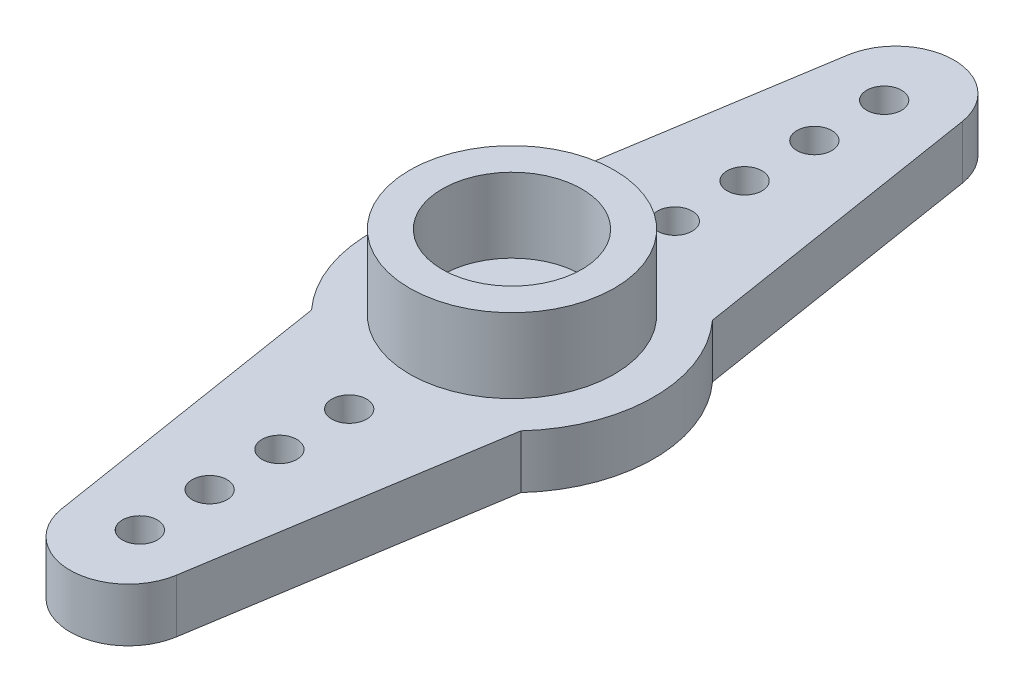
ISO-10303-21;
HEADER;
FILE_DESCRIPTION(('STEP AP214'),'2;1');
FILE_NAME('part.step','',(''),(''),'','','');
FILE_SCHEMA(('AUTOMOTIVE_DESIGN { 1 0 10303 214 1 1 1 1 }'));
ENDSEC;
DATA;
#1=APPLICATION_CONTEXT('core data for automotive mechanical design processes');
#2=APPLICATION_PROTOCOL_DEFINITION('international standard','automotive_design',2000,#1);
#3=PRODUCT_CONTEXT('',#1,'mechanical');
#4=PRODUCT('Part','Part','',(#3));
#5=PRODUCT_RELATED_PRODUCT_CATEGORY('part','',(#4));
#6=PRODUCT_DEFINITION_FORMATION('','',#4);
#7=PRODUCT_DEFINITION_CONTEXT('part definition',#1,'design');
#8=PRODUCT_DEFINITION('design','',#6,#7);
#9=PRODUCT_DEFINITION_SHAPE('','',#8);
#10=(LENGTH_UNIT() NAMED_UNIT(*) SI_UNIT(.MILLI.,.METRE.));
#11=(NAMED_UNIT(*) PLANE_ANGLE_UNIT() SI_UNIT($,.RADIAN.));
#12=(NAMED_UNIT(*) SI_UNIT($,.STERADIAN.) SOLID_ANGLE_UNIT());
#13=UNCERTAINTY_MEASURE_WITH_UNIT(LENGTH_MEASURE(1.E-05),#10,'distance_accuracy_value','');
#14=(GEOMETRIC_REPRESENTATION_CONTEXT(3) GLOBAL_UNCERTAINTY_ASSIGNED_CONTEXT((#13)) GLOBAL_UNIT_ASSIGNED_CONTEXT((#10,
#11,#12)) REPRESENTATION_CONTEXT('',''));
#15=CARTESIAN_POINT('',(0.,0.,0.));
#16=DIRECTION('',(0.,0.,1.));
#17=DIRECTION('',(1.,0.,0.));
#18=AXIS2_PLACEMENT_3D('',#15,#16,#17);
#19=CARTESIAN_POINT('',(0.,2.3,0.));
#20=DIRECTION('',(0.,-1.,0.));
#21=DIRECTION('',(0.,0.,-1.));
#22=AXIS2_PLACEMENT_3D('',#19,#20,#21);
#23=CYLINDRICAL_SURFACE('',#22,6.1);
#24=DIRECTION('',(0.,-1.,0.));
#25=VECTOR('',#24,1.);
#26=CARTESIAN_POINT('',(4.5,2.3,4.1182520563948));
#27=LINE('',#26,#25);
#28=CARTESIAN_POINT('',(4.5,2.3,4.1182520563948));
#29=VERTEX_POINT('',#28);
#30=CARTESIAN_POINT('',(4.5,0.,4.1182520563948));
#31=VERTEX_POINT('',#30);
#32=EDGE_CURVE('E116',#29,#31,#27,.T.);
#33=ORIENTED_EDGE('',*,*,#32,.T.);
#34=CARTESIAN_POINT('',(0.,0.,0.));
#35=DIRECTION('',(0.,1.,0.));
#36=DIRECTION('',(0.,0.,1.));
#37=AXIS2_PLACEMENT_3D('',#34,#35,#36);
#38=CIRCLE('',#37,6.1);
#39=CARTESIAN_POINT('',(4.5,0.,-4.1182520563948));
#40=VERTEX_POINT('',#39);
#41=EDGE_CURVE('E219',#31,#40,#38,.T.);
#42=ORIENTED_EDGE('',*,*,#41,.T.);
#43=DIRECTION('',(0.,-1.,0.));
#44=VECTOR('',#43,1.);
#45=CARTESIAN_POINT('',(4.5,2.3,-4.1182520563948));
#46=LINE('',#45,#44);
#47=CARTESIAN_POINT('',(4.5,2.3,-4.1182520563948));
#48=VERTEX_POINT('',#47);
#49=EDGE_CURVE('E197',#48,#40,#46,.T.);
#50=ORIENTED_EDGE('',*,*,#49,.F.);
#51=CARTESIAN_POINT('',(0.,2.3,0.));
#52=DIRECTION('',(0.,1.,0.));
#53=DIRECTION('',(0.,0.,1.));
#54=AXIS2_PLACEMENT_3D('',#51,#52,#53);
#55=CIRCLE('',#54,6.1);
#56=EDGE_CURVE('E53',#29,#48,#55,.T.);
#57=ORIENTED_EDGE('',*,*,#56,.F.);
#58=EDGE_LOOP('',(#33,#42,#50,#57));
#59=FACE_BOUND('',#58,.T.);
#60=ADVANCED_FACE('F36',(#59),#23,.T.);
#61=CARTESIAN_POINT('',(0.,2.3,0.));
#62=DIRECTION('',(0.,1.,0.));
#63=DIRECTION('',(0.,0.,1.));
#64=AXIS2_PLACEMENT_3D('',#61,#62,#63);
#65=PLANE('',#64);
#66=CARTESIAN_POINT('',(0.,2.3,0.));
#67=DIRECTION('',(0.,1.,0.));
#68=DIRECTION('',(0.,0.,1.));
#69=AXIS2_PLACEMENT_3D('',#66,#67,#68);
#70=CIRCLE('',#69,1.5);
#71=CARTESIAN_POINT('',(0.,2.3,1.5));
#72=VERTEX_POINT('',#71);
#73=EDGE_CURVE('E216',#72,#72,#70,.T.);
#74=ORIENTED_EDGE('',*,*,#73,.F.);
#75=EDGE_LOOP('',(#74));
#76=FACE_BOUND('',#75,.T.);
#77=CARTESIAN_POINT('',(0.,2.3,0.));
#78=DIRECTION('',(0.,1.,0.));
#79=DIRECTION('',(0.,0.,1.));
#80=AXIS2_PLACEMENT_3D('',#77,#78,#79);
#81=CIRCLE('',#80,3.);
#82=CARTESIAN_POINT('',(0.,2.3,3.));
#83=VERTEX_POINT('',#82);
#84=EDGE_CURVE('E200',#83,#83,#81,.T.);
#85=ORIENTED_EDGE('',*,*,#84,.T.);
#86=EDGE_LOOP('',(#85));
#87=FACE_BOUND('',#86,.T.);
#88=ADVANCED_FACE('F247',(#76,#87),#65,.T.);
#89=CARTESIAN_POINT('',(0.,2.3,0.));
#90=DIRECTION('',(0.,1.,0.));
#91=DIRECTION('',(0.,0.,1.));
#92=AXIS2_PLACEMENT_3D('',#89,#90,#91);
#93=CIRCLE('',#92,4.4);
#94=CARTESIAN_POINT('',(0.,2.3,4.4));
#95=VERTEX_POINT('',#94);
#96=EDGE_CURVE('E11',#95,#95,#93,.T.);
#97=ORIENTED_EDGE('',*,*,#96,.F.);
#98=EDGE_LOOP('',(#97));
#99=FACE_BOUND('',#98,.T.);
#100=CARTESIAN_POINT('',(-4.5,2.3,-4.1182520563948));
#101=VERTEX_POINT('',#100);
#102=CARTESIAN_POINT('',(-4.5,2.3,4.1182520563948));
#103=VERTEX_POINT('',#102);
#104=EDGE_CURVE('E45',#101,#103,#55,.T.);
#105=ORIENTED_EDGE('',*,*,#104,.T.);
#106=DIRECTION('',(-0.157019797021949,0.,-0.987595455307074));
#107=VECTOR('',#106,1.);
#108=CARTESIAN_POINT('',(-5.02767726414761,2.3,0.799360567392308));
#109=LINE('',#108,#107);
#110=CARTESIAN_POINT('',(-2.46898863826769,2.3,16.8925494925549));
#111=VERTEX_POINT('',#110);
#112=EDGE_CURVE('E127',#111,#103,#109,.T.);
#113=ORIENTED_EDGE('',*,*,#112,.F.);
#114=CARTESIAN_POINT('',(0.,2.3,16.5));
#115=DIRECTION('',(0.,-1.,0.));
#116=DIRECTION('',(0.,0.,1.));
#117=AXIS2_PLACEMENT_3D('',#114,#115,#116);
#118=CIRCLE('',#117,2.5);
#119=CARTESIAN_POINT('',(2.46898863826768,2.3,16.8925494925549));
#120=VERTEX_POINT('',#119);
#121=EDGE_CURVE('E108',#120,#111,#118,.T.);
#122=ORIENTED_EDGE('',*,*,#121,.F.);
#123=DIRECTION('',(0.15701979702195,0.,-0.987595455307073));
#124=VECTOR('',#123,1.);
#125=CARTESIAN_POINT('',(5.02767726414761,2.3,0.799360567392309));
#126=LINE('',#125,#124);
#127=EDGE_CURVE('E119',#120,#29,#126,.T.);
#128=ORIENTED_EDGE('',*,*,#127,.T.);
#129=ORIENTED_EDGE('',*,*,#56,.T.);
#130=DIRECTION('',(0.157019797021949,0.,0.987595455307074));
#131=VECTOR('',#130,1.);
#132=CARTESIAN_POINT('',(5.02767726414761,2.3,-0.799360567392308));
#133=LINE('',#132,#131);
#134=CARTESIAN_POINT('',(2.46898863826769,2.3,-16.8925494925549));
#135=VERTEX_POINT('',#134);
#136=EDGE_CURVE('E174',#135,#48,#133,.T.);
#137=ORIENTED_EDGE('',*,*,#136,.F.);
#138=CARTESIAN_POINT('',(0.,2.3,-16.5));
#139=DIRECTION('',(0.,-1.,0.));
#140=DIRECTION('',(0.,0.,-1.));
#141=AXIS2_PLACEMENT_3D('',#138,#139,#140);
#142=CIRCLE('',#141,2.5);
#143=CARTESIAN_POINT('',(-2.46898863826768,2.3,-16.8925494925549));
#144=VERTEX_POINT('',#143);
#145=EDGE_CURVE('E171',#144,#135,#142,.T.);
#146=ORIENTED_EDGE('',*,*,#145,.F.);
#147=DIRECTION('',(-0.15701979702195,0.,0.987595455307073));
#148=VECTOR('',#147,1.);
#149=CARTESIAN_POINT('',(-5.02767726414761,2.3,-0.799360567392309));
#150=LINE('',#149,#148);
#151=EDGE_CURVE('E168',#144,#101,#150,.T.);
#152=ORIENTED_EDGE('',*,*,#151,.T.);
#153=EDGE_LOOP('',(#105,#113,#122,#128,#129,#137,#146,#152));
#154=FACE_BOUND('',#153,.T.);
#155=CARTESIAN_POINT('',(0.,2.3,-7.));
#156=DIRECTION('',(0.,-1.,0.));
#157=DIRECTION('',(0.,0.,-1.));
#158=AXIS2_PLACEMENT_3D('',#155,#156,#157);
#159=CIRCLE('',#158,0.75);
#160=CARTESIAN_POINT('',(0.,2.3,-7.75));
#161=VERTEX_POINT('',#160);
#162=EDGE_CURVE('E155',#161,#161,#159,.T.);
#163=ORIENTED_EDGE('',*,*,#162,.T.);
#164=EDGE_LOOP('',(#163));
#165=FACE_BOUND('',#164,.T.);
#166=CARTESIAN_POINT('',(0.,2.3,-10.));
#167=DIRECTION('',(0.,-1.,0.));
#168=DIRECTION('',(0.,0.,-1.));
#169=AXIS2_PLACEMENT_3D('',#166,#167,#168);
#170=CIRCLE('',#169,0.750000000000001);
#171=CARTESIAN_POINT('',(0.,2.3,-10.75));
#172=VERTEX_POINT('',#171);
#173=EDGE_CURVE('E158',#172,#172,#170,.T.);
#174=ORIENTED_EDGE('',*,*,#173,.T.);
#175=EDGE_LOOP('',(#174));
#176=FACE_BOUND('',#175,.T.);
#177=CARTESIAN_POINT('',(0.,2.3,-13.));
#178=DIRECTION('',(0.,-1.,0.));
#179=DIRECTION('',(0.,0.,-1.));
#180=AXIS2_PLACEMENT_3D('',#177,#178,#179);
#181=CIRCLE('',#180,0.750000000000001);
#182=CARTESIAN_POINT('',(0.,2.3,-13.75));
#183=VERTEX_POINT('',#182);
#184=EDGE_CURVE('E162',#183,#183,#181,.T.);
#185=ORIENTED_EDGE('',*,*,#184,.T.);
#186=EDGE_LOOP('',(#185));
#187=FACE_BOUND('',#186,.T.);
#188=CARTESIAN_POINT('',(0.,2.3,-16.));
#189=DIRECTION('',(0.,-1.,0.));
#190=DIRECTION('',(0.,0.,-1.));
#191=AXIS2_PLACEMENT_3D('',#188,#189,#190);
#192=CIRCLE('',#191,0.75);
#193=CARTESIAN_POINT('',(0.,2.3,-16.75));
#194=VERTEX_POINT('',#193);
#195=EDGE_CURVE('E165',#194,#194,#192,.T.);
#196=ORIENTED_EDGE('',*,*,#195,.T.);
#197=EDGE_LOOP('',(#196));
#198=FACE_BOUND('',#197,.T.);
#199=CARTESIAN_POINT('',(0.,2.3,7.));
#200=DIRECTION('',(0.,-1.,0.));
#201=DIRECTION('',(0.,0.,1.));
#202=AXIS2_PLACEMENT_3D('',#199,#200,#201);
#203=CIRCLE('',#202,0.75);
#204=CARTESIAN_POINT('',(0.,2.3,7.75));
#205=VERTEX_POINT('',#204);
#206=EDGE_CURVE('E150',#205,#205,#203,.T.);
#207=ORIENTED_EDGE('',*,*,#206,.T.);
#208=EDGE_LOOP('',(#207));
#209=FACE_BOUND('',#208,.T.);
#210=CARTESIAN_POINT('',(0.,2.3,10.));
#211=DIRECTION('',(0.,-1.,0.));
#212=DIRECTION('',(0.,0.,1.));
#213=AXIS2_PLACEMENT_3D('',#210,#211,#212);
#214=CIRCLE('',#213,0.750000000000001);
#215=CARTESIAN_POINT('',(0.,2.3,10.75));
#216=VERTEX_POINT('',#215);
#217=EDGE_CURVE('E481',#216,#216,#214,.T.);
#218=ORIENTED_EDGE('',*,*,#217,.T.);
#219=EDGE_LOOP('',(#218));
#220=FACE_BOUND('',#219,.T.);
#221=CARTESIAN_POINT('',(0.,2.3,13.));
#222=DIRECTION('',(0.,-1.,0.));
#223=DIRECTION('',(0.,0.,1.));
#224=AXIS2_PLACEMENT_3D('',#221,#222,#223);
#225=CIRCLE('',#224,0.750000000000001);
#226=CARTESIAN_POINT('',(0.,2.3,13.75));
#227=VERTEX_POINT('',#226);
#228=EDGE_CURVE('E479',#227,#227,#225,.T.);
#229=ORIENTED_EDGE('',*,*,#228,.T.);
#230=EDGE_LOOP('',(#229));
#231=FACE_BOUND('',#230,.T.);
#232=CARTESIAN_POINT('',(0.,2.3,16.));
#233=DIRECTION('',(0.,-1.,0.));
#234=DIRECTION('',(0.,0.,1.));
#235=AXIS2_PLACEMENT_3D('',#232,#233,#234);
#236=CIRCLE('',#235,0.75);
#237=CARTESIAN_POINT('',(0.,2.3,16.75));
#238=VERTEX_POINT('',#237);
#239=EDGE_CURVE('E122',#238,#238,#236,.T.);
#240=ORIENTED_EDGE('',*,*,#239,.T.);
#241=EDGE_LOOP('',(#240));
#242=FACE_BOUND('',#241,.T.);
#243=ADVANCED_FACE('F124',(#99,#154,#165,#176,#187,#198,#209,#220,#231,#242),#65,.T.);
#244=CARTESIAN_POINT('',(0.,0.,0.));
#245=DIRECTION('',(0.,1.,0.));
#246=DIRECTION('',(0.,0.,1.));
#247=AXIS2_PLACEMENT_3D('',#244,#245,#246);
#248=PLANE('',#247);
#249=CARTESIAN_POINT('',(-4.5,0.,-4.1182520563948));
#250=VERTEX_POINT('',#249);
#251=CARTESIAN_POINT('',(-4.5,0.,4.1182520563948));
#252=VERTEX_POINT('',#251);
#253=EDGE_CURVE('E40',#250,#252,#38,.T.);
#254=ORIENTED_EDGE('',*,*,#253,.F.);
#255=DIRECTION('',(-0.15701979702195,0.,0.987595455307073));
#256=VECTOR('',#255,1.);
#257=CARTESIAN_POINT('',(-5.02767726414761,0.,-0.799360567392309));
#258=LINE('',#257,#256);
#259=CARTESIAN_POINT('',(-2.46898863826768,0.,-16.8925494925549));
#260=VERTEX_POINT('',#259);
#261=EDGE_CURVE('E189',#260,#250,#258,.T.);
#262=ORIENTED_EDGE('',*,*,#261,.F.);
#263=CARTESIAN_POINT('',(0.,0.,-16.5));
#264=DIRECTION('',(0.,-1.,0.));
#265=DIRECTION('',(0.,0.,-1.));
#266=AXIS2_PLACEMENT_3D('',#263,#264,#265);
#267=CIRCLE('',#266,2.5);
#268=CARTESIAN_POINT('',(2.46898863826769,0.,-16.8925494925549));
#269=VERTEX_POINT('',#268);
#270=EDGE_CURVE('E192',#260,#269,#267,.T.);
#271=ORIENTED_EDGE('',*,*,#270,.T.);
#272=DIRECTION('',(0.157019797021949,0.,0.987595455307074));
#273=VECTOR('',#272,1.);
#274=CARTESIAN_POINT('',(5.02767726414761,0.,-0.799360567392308));
#275=LINE('',#274,#273);
#276=EDGE_CURVE('E159',#269,#40,#275,.T.);
#277=ORIENTED_EDGE('',*,*,#276,.T.);
#278=ORIENTED_EDGE('',*,*,#41,.F.);
#279=DIRECTION('',(0.15701979702195,0.,-0.987595455307073));
#280=VECTOR('',#279,1.);
#281=CARTESIAN_POINT('',(5.02767726414761,0.,0.799360567392309));
#282=LINE('',#281,#280);
#283=CARTESIAN_POINT('',(2.46898863826768,0.,16.8925494925549));
#284=VERTEX_POINT('',#283);
#285=EDGE_CURVE('E144',#284,#31,#282,.T.);
#286=ORIENTED_EDGE('',*,*,#285,.F.);
#287=CARTESIAN_POINT('',(0.,0.,16.5));
#288=DIRECTION('',(0.,-1.,0.));
#289=DIRECTION('',(0.,0.,1.));
#290=AXIS2_PLACEMENT_3D('',#287,#288,#289);
#291=CIRCLE('',#290,2.5);
#292=CARTESIAN_POINT('',(-2.46898863826769,0.,16.8925494925549));
#293=VERTEX_POINT('',#292);
#294=EDGE_CURVE('E111',#284,#293,#291,.T.);
#295=ORIENTED_EDGE('',*,*,#294,.T.);
#296=DIRECTION('',(-0.157019797021949,0.,-0.987595455307074));
#297=VECTOR('',#296,1.);
#298=CARTESIAN_POINT('',(-5.02767726414761,0.,0.799360567392308));
#299=LINE('',#298,#297);
#300=EDGE_CURVE('E147',#293,#252,#299,.T.);
#301=ORIENTED_EDGE('',*,*,#300,.T.);
#302=EDGE_LOOP('',(#254,#262,#271,#277,#278,#286,#295,#301));
#303=FACE_BOUND('',#302,.T.);
#304=CARTESIAN_POINT('',(0.,0.,0.));
#305=DIRECTION('',(0.,1.,0.));
#306=DIRECTION('',(0.,0.,1.));
#307=AXIS2_PLACEMENT_3D('',#304,#305,#306);
#308=CIRCLE('',#307,1.5);
#309=CARTESIAN_POINT('',(0.,0.,1.5));
#310=VERTEX_POINT('',#309);
#311=EDGE_CURVE('E214',#310,#310,#308,.T.);
#312=ORIENTED_EDGE('',*,*,#311,.T.);
#313=EDGE_LOOP('',(#312));
#314=FACE_BOUND('',#313,.T.);
#315=CARTESIAN_POINT('',(0.,0.,-7.));
#316=DIRECTION('',(0.,-1.,0.));
#317=DIRECTION('',(0.,0.,-1.));
#318=AXIS2_PLACEMENT_3D('',#315,#316,#317);
#319=CIRCLE('',#318,0.75);
#320=CARTESIAN_POINT('',(0.,0.,-7.75));
#321=VERTEX_POINT('',#320);
#322=EDGE_CURVE('E152',#321,#321,#319,.T.);
#323=ORIENTED_EDGE('',*,*,#322,.F.);
#324=EDGE_LOOP('',(#323));
#325=FACE_BOUND('',#324,.T.);
#326=CARTESIAN_POINT('',(0.,0.,-10.));
#327=DIRECTION('',(0.,-1.,0.));
#328=DIRECTION('',(0.,0.,-1.));
#329=AXIS2_PLACEMENT_3D('',#326,#327,#328);
#330=CIRCLE('',#329,0.750000000000001);
#331=CARTESIAN_POINT('',(0.,0.,-10.75));
#332=VERTEX_POINT('',#331);
#333=EDGE_CURVE('E180',#332,#332,#330,.T.);
#334=ORIENTED_EDGE('',*,*,#333,.F.);
#335=EDGE_LOOP('',(#334));
#336=FACE_BOUND('',#335,.T.);
#337=CARTESIAN_POINT('',(0.,0.,-13.));
#338=DIRECTION('',(0.,-1.,0.));
#339=DIRECTION('',(0.,0.,-1.));
#340=AXIS2_PLACEMENT_3D('',#337,#338,#339);
#341=CIRCLE('',#340,0.750000000000001);
#342=CARTESIAN_POINT('',(0.,0.,-13.75));
#343=VERTEX_POINT('',#342);
#344=EDGE_CURVE('E183',#343,#343,#341,.T.);
#345=ORIENTED_EDGE('',*,*,#344,.F.);
#346=EDGE_LOOP('',(#345));
#347=FACE_BOUND('',#346,.T.);
#348=CARTESIAN_POINT('',(0.,0.,-16.));
#349=DIRECTION('',(0.,-1.,0.));
#350=DIRECTION('',(0.,0.,-1.));
#351=AXIS2_PLACEMENT_3D('',#348,#349,#350);
#352=CIRCLE('',#351,0.75);
#353=CARTESIAN_POINT('',(0.,0.,-16.75));
#354=VERTEX_POINT('',#353);
#355=EDGE_CURVE('E186',#354,#354,#352,.T.);
#356=ORIENTED_EDGE('',*,*,#355,.F.);
#357=EDGE_LOOP('',(#356));
#358=FACE_BOUND('',#357,.T.);
#359=CARTESIAN_POINT('',(0.,0.,7.));
#360=DIRECTION('',(0.,-1.,0.));
#361=DIRECTION('',(0.,0.,1.));
#362=AXIS2_PLACEMENT_3D('',#359,#360,#361);
#363=CIRCLE('',#362,0.75);
#364=CARTESIAN_POINT('',(0.,0.,7.75));
#365=VERTEX_POINT('',#364);
#366=EDGE_CURVE('E132',#365,#365,#363,.T.);
#367=ORIENTED_EDGE('',*,*,#366,.F.);
#368=EDGE_LOOP('',(#367));
#369=FACE_BOUND('',#368,.T.);
#370=CARTESIAN_POINT('',(0.,0.,10.));
#371=DIRECTION('',(0.,-1.,0.));
#372=DIRECTION('',(0.,0.,1.));
#373=AXIS2_PLACEMENT_3D('',#370,#371,#372);
#374=CIRCLE('',#373,0.750000000000001);
#375=CARTESIAN_POINT('',(0.,0.,10.75));
#376=VERTEX_POINT('',#375);
#377=EDGE_CURVE('E135',#376,#376,#374,.T.);
#378=ORIENTED_EDGE('',*,*,#377,.F.);
#379=EDGE_LOOP('',(#378));
#380=FACE_BOUND('',#379,.T.);
#381=CARTESIAN_POINT('',(0.,0.,13.));
#382=DIRECTION('',(0.,-1.,0.));
#383=DIRECTION('',(0.,0.,1.));
#384=AXIS2_PLACEMENT_3D('',#381,#382,#383);
#385=CIRCLE('',#384,0.750000000000001);
#386=CARTESIAN_POINT('',(0.,0.,13.75));
#387=VERTEX_POINT('',#386);
#388=EDGE_CURVE('E138',#387,#387,#385,.T.);
#389=ORIENTED_EDGE('',*,*,#388,.F.);
#390=EDGE_LOOP('',(#389));
#391=FACE_BOUND('',#390,.T.);
#392=CARTESIAN_POINT('',(0.,0.,16.));
#393=DIRECTION('',(0.,-1.,0.));
#394=DIRECTION('',(0.,0.,1.));
#395=AXIS2_PLACEMENT_3D('',#392,#393,#394);
#396=CIRCLE('',#395,0.75);
#397=CARTESIAN_POINT('',(0.,0.,16.75));
#398=VERTEX_POINT('',#397);
#399=EDGE_CURVE('E141',#398,#398,#396,.T.);
#400=ORIENTED_EDGE('',*,*,#399,.F.);
#401=EDGE_LOOP('',(#400));
#402=FACE_BOUND('',#401,.T.);
#403=ADVANCED_FACE('F226',(#303,#314,#325,#336,#347,#358,#369,#380,#391,#402),#248,.F.);
#404=ORIENTED_EDGE('',*,*,#253,.T.);
#405=DIRECTION('',(0.,-1.,0.));
#406=VECTOR('',#405,1.);
#407=CARTESIAN_POINT('',(-4.5,2.3,4.1182520563948));
#408=LINE('',#407,#406);
#409=EDGE_CURVE('E61',#103,#252,#408,.T.);
#410=ORIENTED_EDGE('',*,*,#409,.F.);
#411=ORIENTED_EDGE('',*,*,#104,.F.);
#412=DIRECTION('',(0.,-1.,0.));
#413=VECTOR('',#412,1.);
#414=CARTESIAN_POINT('',(-4.5,2.3,-4.1182520563948));
#415=LINE('',#414,#413);
#416=EDGE_CURVE('E177',#101,#250,#415,.T.);
#417=ORIENTED_EDGE('',*,*,#416,.T.);
#418=EDGE_LOOP('',(#404,#410,#411,#417));
#419=FACE_BOUND('',#418,.T.);
#420=ADVANCED_FACE('F38',(#419),#23,.T.);
#421=CARTESIAN_POINT('',(0.,2.3,0.));
#422=DIRECTION('',(0.,-1.,0.));
#423=DIRECTION('',(0.,0.,-1.));
#424=AXIS2_PLACEMENT_3D('',#421,#422,#423);
#425=CYLINDRICAL_SURFACE('',#424,1.5);
#426=ORIENTED_EDGE('',*,*,#73,.T.);
#427=EDGE_LOOP('',(#426));
#428=FACE_BOUND('',#427,.T.);
#429=ORIENTED_EDGE('',*,*,#311,.F.);
#430=EDGE_LOOP('',(#429));
#431=FACE_BOUND('',#430,.T.);
#432=ADVANCED_FACE('F238',(#428,#431),#425,.F.);
#433=CARTESIAN_POINT('',(0.,5.5,0.));
#434=DIRECTION('',(0.,1.,0.));
#435=DIRECTION('',(0.,0.,1.));
#436=AXIS2_PLACEMENT_3D('',#433,#434,#435);
#437=PLANE('',#436);
#438=CARTESIAN_POINT('',(0.,5.5,0.));
#439=DIRECTION('',(0.,1.,0.));
#440=DIRECTION('',(0.,0.,1.));
#441=AXIS2_PLACEMENT_3D('',#438,#439,#440);
#442=CIRCLE('',#441,4.4);
#443=CARTESIAN_POINT('',(0.,5.5,4.4));
#444=VERTEX_POINT('',#443);
#445=EDGE_CURVE('E210',#444,#444,#442,.T.);
#446=ORIENTED_EDGE('',*,*,#445,.T.);
#447=EDGE_LOOP('',(#446));
#448=FACE_BOUND('',#447,.T.);
#449=CARTESIAN_POINT('',(0.,5.5,0.));
#450=DIRECTION('',(0.,1.,0.));
#451=DIRECTION('',(0.,0.,1.));
#452=AXIS2_PLACEMENT_3D('',#449,#450,#451);
#453=CIRCLE('',#452,3.);
#454=CARTESIAN_POINT('',(0.,5.5,3.));
#455=VERTEX_POINT('',#454);
#456=EDGE_CURVE('E207',#455,#455,#453,.T.);
#457=ORIENTED_EDGE('',*,*,#456,.F.);
#458=EDGE_LOOP('',(#457));
#459=FACE_BOUND('',#458,.T.);
#460=ADVANCED_FACE('F243',(#448,#459),#437,.T.);
#461=CARTESIAN_POINT('',(0.,5.5,0.));
#462=DIRECTION('',(0.,-1.,0.));
#463=DIRECTION('',(0.,0.,-1.));
#464=AXIS2_PLACEMENT_3D('',#461,#462,#463);
#465=CYLINDRICAL_SURFACE('',#464,4.4);
#466=ORIENTED_EDGE('',*,*,#445,.F.);
#467=EDGE_LOOP('',(#466));
#468=FACE_BOUND('',#467,.T.);
#469=ORIENTED_EDGE('',*,*,#96,.T.);
#470=EDGE_LOOP('',(#469));
#471=FACE_BOUND('',#470,.T.);
#472=ADVANCED_FACE('F260',(#468,#471),#465,.T.);
#473=CARTESIAN_POINT('',(0.,5.5,0.));
#474=DIRECTION('',(0.,-1.,0.));
#475=DIRECTION('',(0.,0.,-1.));
#476=AXIS2_PLACEMENT_3D('',#473,#474,#475);
#477=CYLINDRICAL_SURFACE('',#476,3.);
#478=ORIENTED_EDGE('',*,*,#456,.T.);
#479=EDGE_LOOP('',(#478));
#480=FACE_BOUND('',#479,.T.);
#481=ORIENTED_EDGE('',*,*,#84,.F.);
#482=EDGE_LOOP('',(#481));
#483=FACE_BOUND('',#482,.T.);
#484=ADVANCED_FACE('F263',(#480,#483),#477,.F.);
#485=CARTESIAN_POINT('',(5.02767726414761,2.3,-0.799360567392308));
#486=DIRECTION('',(0.987595455307073,0.,-0.157019797021949));
#487=DIRECTION('',(-0.157019797021949,0.,-0.987595455307074));
#488=AXIS2_PLACEMENT_3D('',#485,#486,#487);
#489=PLANE('',#488);
#490=ORIENTED_EDGE('',*,*,#276,.F.);
#491=DIRECTION('',(0.,-1.,0.));
#492=VECTOR('',#491,1.);
#493=CARTESIAN_POINT('',(2.46898863826769,2.3,-16.8925494925549));
#494=LINE('',#493,#492);
#495=EDGE_CURVE('E201',#135,#269,#494,.T.);
#496=ORIENTED_EDGE('',*,*,#495,.F.);
#497=ORIENTED_EDGE('',*,*,#136,.T.);
#498=ORIENTED_EDGE('',*,*,#49,.T.);
#499=EDGE_LOOP('',(#490,#496,#497,#498));
#500=FACE_BOUND('',#499,.T.);
#501=ADVANCED_FACE('F225',(#500),#489,.T.);
#502=CARTESIAN_POINT('',(0.,2.3,-16.5));
#503=DIRECTION('',(0.,-1.,0.));
#504=DIRECTION('',(0.,0.,-1.));
#505=AXIS2_PLACEMENT_3D('',#502,#503,#504);
#506=CYLINDRICAL_SURFACE('',#505,2.5);
#507=ORIENTED_EDGE('',*,*,#270,.F.);
#508=DIRECTION('',(0.,-1.,0.));
#509=VECTOR('',#508,1.);
#510=CARTESIAN_POINT('',(-2.46898863826768,2.3,-16.8925494925549));
#511=LINE('',#510,#509);
#512=EDGE_CURVE('E203',#144,#260,#511,.T.);
#513=ORIENTED_EDGE('',*,*,#512,.F.);
#514=ORIENTED_EDGE('',*,*,#145,.T.);
#515=ORIENTED_EDGE('',*,*,#495,.T.);
#516=EDGE_LOOP('',(#507,#513,#514,#515));
#517=FACE_BOUND('',#516,.T.);
#518=ADVANCED_FACE('F231',(#517),#506,.T.);
#519=CARTESIAN_POINT('',(0.,2.3,-16.));
#520=DIRECTION('',(0.,-1.,0.));
#521=DIRECTION('',(0.,0.,-1.));
#522=AXIS2_PLACEMENT_3D('',#519,#520,#521);
#523=CYLINDRICAL_SURFACE('',#522,0.75);
#524=ORIENTED_EDGE('',*,*,#195,.F.);
#525=EDGE_LOOP('',(#524));
#526=FACE_BOUND('',#525,.T.);
#527=ORIENTED_EDGE('',*,*,#355,.T.);
#528=EDGE_LOOP('',(#527));
#529=FACE_BOUND('',#528,.T.);
#530=ADVANCED_FACE('F282',(#526,#529),#523,.F.);
#531=CARTESIAN_POINT('',(0.,2.3,-13.));
#532=DIRECTION('',(0.,-1.,0.));
#533=DIRECTION('',(0.,0.,-1.));
#534=AXIS2_PLACEMENT_3D('',#531,#532,#533);
#535=CYLINDRICAL_SURFACE('',#534,0.750000000000001);
#536=ORIENTED_EDGE('',*,*,#184,.F.);
#537=EDGE_LOOP('',(#536));
#538=FACE_BOUND('',#537,.T.);
#539=ORIENTED_EDGE('',*,*,#344,.T.);
#540=EDGE_LOOP('',(#539));
#541=FACE_BOUND('',#540,.T.);
#542=ADVANCED_FACE('F278',(#538,#541),#535,.F.);
#543=CARTESIAN_POINT('',(0.,2.3,-10.));
#544=DIRECTION('',(0.,-1.,0.));
#545=DIRECTION('',(0.,0.,-1.));
#546=AXIS2_PLACEMENT_3D('',#543,#544,#545);
#547=CYLINDRICAL_SURFACE('',#546,0.750000000000001);
#548=ORIENTED_EDGE('',*,*,#173,.F.);
#549=EDGE_LOOP('',(#548));
#550=FACE_BOUND('',#549,.T.);
#551=ORIENTED_EDGE('',*,*,#333,.T.);
#552=EDGE_LOOP('',(#551));
#553=FACE_BOUND('',#552,.T.);
#554=ADVANCED_FACE('F274',(#550,#553),#547,.F.);
#555=CARTESIAN_POINT('',(0.,2.3,-7.));
#556=DIRECTION('',(0.,-1.,0.));
#557=DIRECTION('',(0.,0.,-1.));
#558=AXIS2_PLACEMENT_3D('',#555,#556,#557);
#559=CYLINDRICAL_SURFACE('',#558,0.75);
#560=ORIENTED_EDGE('',*,*,#162,.F.);
#561=EDGE_LOOP('',(#560));
#562=FACE_BOUND('',#561,.T.);
#563=ORIENTED_EDGE('',*,*,#322,.T.);
#564=EDGE_LOOP('',(#563));
#565=FACE_BOUND('',#564,.T.);
#566=ADVANCED_FACE('F271',(#562,#565),#559,.F.);
#567=CARTESIAN_POINT('',(-5.02767726414761,2.3,-0.799360567392309));
#568=DIRECTION('',(0.987595455307073,0.,0.15701979702195));
#569=DIRECTION('',(0.15701979702195,0.,-0.987595455307073));
#570=AXIS2_PLACEMENT_3D('',#567,#568,#569);
#571=PLANE('',#570);
#572=ORIENTED_EDGE('',*,*,#261,.T.);
#573=ORIENTED_EDGE('',*,*,#416,.F.);
#574=ORIENTED_EDGE('',*,*,#151,.F.);
#575=ORIENTED_EDGE('',*,*,#512,.T.);
#576=EDGE_LOOP('',(#572,#573,#574,#575));
#577=FACE_BOUND('',#576,.T.);
#578=ADVANCED_FACE('F236',(#577),#571,.F.);
#579=CARTESIAN_POINT('',(-5.02767726414761,2.3,0.799360567392308));
#580=DIRECTION('',(-0.987595455307073,0.,0.157019797021949));
#581=DIRECTION('',(0.157019797021949,0.,0.987595455307074));
#582=AXIS2_PLACEMENT_3D('',#579,#580,#581);
#583=PLANE('',#582);
#584=ORIENTED_EDGE('',*,*,#300,.F.);
#585=DIRECTION('',(0.,-1.,0.));
#586=VECTOR('',#585,1.);
#587=CARTESIAN_POINT('',(-2.46898863826769,2.3,16.8925494925549));
#588=LINE('',#587,#586);
#589=EDGE_CURVE('E115',#111,#293,#588,.T.);
#590=ORIENTED_EDGE('',*,*,#589,.F.);
#591=ORIENTED_EDGE('',*,*,#112,.T.);
#592=ORIENTED_EDGE('',*,*,#409,.T.);
#593=EDGE_LOOP('',(#584,#590,#591,#592));
#594=FACE_BOUND('',#593,.T.);
#595=ADVANCED_FACE('F289',(#594),#583,.T.);
#596=CARTESIAN_POINT('',(0.,2.3,16.5));
#597=DIRECTION('',(0.,-1.,0.));
#598=DIRECTION('',(0.,0.,-1.));
#599=AXIS2_PLACEMENT_3D('',#596,#597,#598);
#600=CYLINDRICAL_SURFACE('',#599,2.5);
#601=ORIENTED_EDGE('',*,*,#294,.F.);
#602=DIRECTION('',(0.,-1.,0.));
#603=VECTOR('',#602,1.);
#604=CARTESIAN_POINT('',(2.46898863826768,2.3,16.8925494925549));
#605=LINE('',#604,#603);
#606=EDGE_CURVE('E104',#120,#284,#605,.T.);
#607=ORIENTED_EDGE('',*,*,#606,.F.);
#608=ORIENTED_EDGE('',*,*,#121,.T.);
#609=ORIENTED_EDGE('',*,*,#589,.T.);
#610=EDGE_LOOP('',(#601,#607,#608,#609));
#611=FACE_BOUND('',#610,.T.);
#612=ADVANCED_FACE('F106',(#611),#600,.T.);
#613=CARTESIAN_POINT('',(0.,2.3,16.));
#614=DIRECTION('',(0.,-1.,0.));
#615=DIRECTION('',(0.,0.,-1.));
#616=AXIS2_PLACEMENT_3D('',#613,#614,#615);
#617=CYLINDRICAL_SURFACE('',#616,0.75);
#618=ORIENTED_EDGE('',*,*,#239,.F.);
#619=EDGE_LOOP('',(#618));
#620=FACE_BOUND('',#619,.T.);
#621=ORIENTED_EDGE('',*,*,#399,.T.);
#622=EDGE_LOOP('',(#621));
#623=FACE_BOUND('',#622,.T.);
#624=ADVANCED_FACE('F305',(#620,#623),#617,.F.);
#625=CARTESIAN_POINT('',(0.,2.3,13.));
#626=DIRECTION('',(0.,-1.,0.));
#627=DIRECTION('',(0.,0.,-1.));
#628=AXIS2_PLACEMENT_3D('',#625,#626,#627);
#629=CYLINDRICAL_SURFACE('',#628,0.750000000000001);
#630=ORIENTED_EDGE('',*,*,#228,.F.);
#631=EDGE_LOOP('',(#630));
#632=FACE_BOUND('',#631,.T.);
#633=ORIENTED_EDGE('',*,*,#388,.T.);
#634=EDGE_LOOP('',(#633));
#635=FACE_BOUND('',#634,.T.);
#636=ADVANCED_FACE('F301',(#632,#635),#629,.F.);
#637=CARTESIAN_POINT('',(0.,2.3,10.));
#638=DIRECTION('',(0.,-1.,0.));
#639=DIRECTION('',(0.,0.,-1.));
#640=AXIS2_PLACEMENT_3D('',#637,#638,#639);
#641=CYLINDRICAL_SURFACE('',#640,0.750000000000001);
#642=ORIENTED_EDGE('',*,*,#217,.F.);
#643=EDGE_LOOP('',(#642));
#644=FACE_BOUND('',#643,.T.);
#645=ORIENTED_EDGE('',*,*,#377,.T.);
#646=EDGE_LOOP('',(#645));
#647=FACE_BOUND('',#646,.T.);
#648=ADVANCED_FACE('F297',(#644,#647),#641,.F.);
#649=CARTESIAN_POINT('',(0.,2.3,7.));
#650=DIRECTION('',(0.,-1.,0.));
#651=DIRECTION('',(0.,0.,-1.));
#652=AXIS2_PLACEMENT_3D('',#649,#650,#651);
#653=CYLINDRICAL_SURFACE('',#652,0.75);
#654=ORIENTED_EDGE('',*,*,#206,.F.);
#655=EDGE_LOOP('',(#654));
#656=FACE_BOUND('',#655,.T.);
#657=ORIENTED_EDGE('',*,*,#366,.T.);
#658=EDGE_LOOP('',(#657));
#659=FACE_BOUND('',#658,.T.);
#660=ADVANCED_FACE('F294',(#656,#659),#653,.F.);
#661=CARTESIAN_POINT('',(5.02767726414761,2.3,0.799360567392309));
#662=DIRECTION('',(-0.987595455307073,0.,-0.15701979702195));
#663=DIRECTION('',(-0.15701979702195,0.,0.987595455307073));
#664=AXIS2_PLACEMENT_3D('',#661,#662,#663);
#665=PLANE('',#664);
#666=ORIENTED_EDGE('',*,*,#285,.T.);
#667=ORIENTED_EDGE('',*,*,#32,.F.);
#668=ORIENTED_EDGE('',*,*,#127,.F.);
#669=ORIENTED_EDGE('',*,*,#606,.T.);
#670=EDGE_LOOP('',(#666,#667,#668,#669));
#671=FACE_BOUND('',#670,.T.);
#672=ADVANCED_FACE('F120',(#671),#665,.F.);
#673=CLOSED_SHELL('',(#60,#88,#243,#403,#420,#432,#460,#472,#484,#501,#518,#530,#542,#554,#566,
#578,#595,#612,#624,#636,#648,#660,#672));
#674=MANIFOLD_SOLID_BREP('B2',#673);
#675=ADVANCED_BREP_SHAPE_REPRESENTATION('',(#18,#674),#14);
#676=SHAPE_DEFINITION_REPRESENTATION(#9,#675);
ENDSEC;
END-ISO-10303-21;
